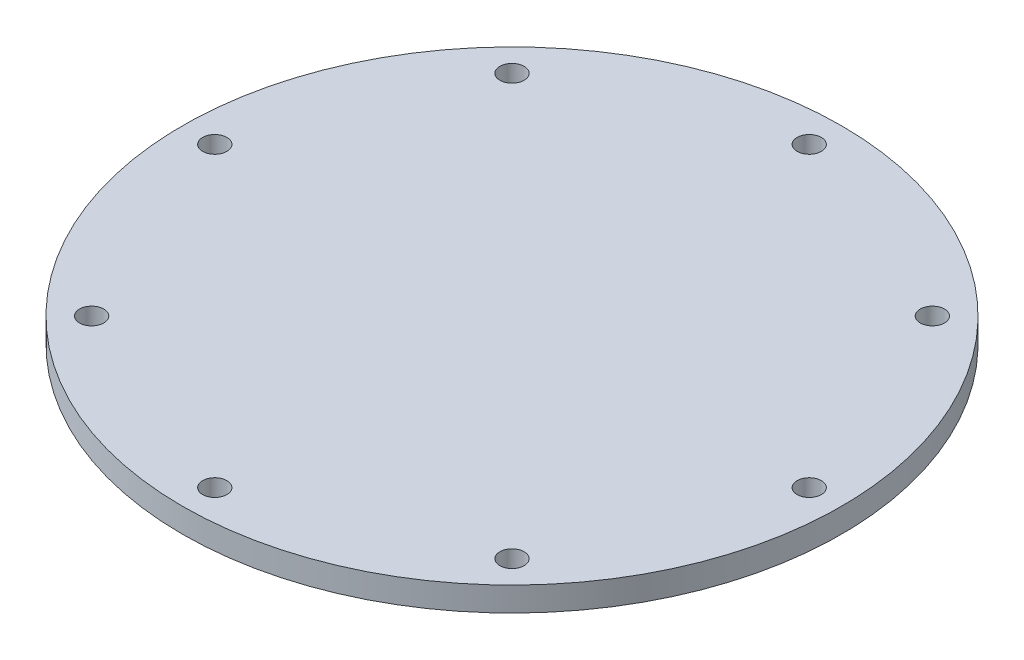
ISO-10303-21;
HEADER;
FILE_DESCRIPTION(('STEP AP214'),'2;1');
FILE_NAME('part.step','',(''),(''),'','','');
FILE_SCHEMA(('AUTOMOTIVE_DESIGN { 1 0 10303 214 1 1 1 1 }'));
ENDSEC;
DATA;
#1=APPLICATION_CONTEXT('core data for automotive mechanical design processes');
#2=APPLICATION_PROTOCOL_DEFINITION('international standard','automotive_design',2000,#1);
#3=PRODUCT_CONTEXT('',#1,'mechanical');
#4=PRODUCT('Part','Part','',(#3));
#5=PRODUCT_RELATED_PRODUCT_CATEGORY('part','',(#4));
#6=PRODUCT_DEFINITION_FORMATION('','',#4);
#7=PRODUCT_DEFINITION_CONTEXT('part definition',#1,'design');
#8=PRODUCT_DEFINITION('design','',#6,#7);
#9=PRODUCT_DEFINITION_SHAPE('','',#8);
#10=(LENGTH_UNIT() NAMED_UNIT(*) SI_UNIT(.MILLI.,.METRE.));
#11=(NAMED_UNIT(*) PLANE_ANGLE_UNIT() SI_UNIT($,.RADIAN.));
#12=(NAMED_UNIT(*) SI_UNIT($,.STERADIAN.) SOLID_ANGLE_UNIT());
#13=UNCERTAINTY_MEASURE_WITH_UNIT(LENGTH_MEASURE(1.E-05),#10,'distance_accuracy_value','');
#14=(GEOMETRIC_REPRESENTATION_CONTEXT(3) GLOBAL_UNCERTAINTY_ASSIGNED_CONTEXT((#13)) GLOBAL_UNIT_ASSIGNED_CONTEXT((#10,
#11,#12)) REPRESENTATION_CONTEXT('',''));
#15=CARTESIAN_POINT('',(0.,0.,0.));
#16=DIRECTION('',(0.,0.,1.));
#17=DIRECTION('',(1.,0.,0.));
#18=AXIS2_PLACEMENT_3D('',#15,#16,#17);
#19=CARTESIAN_POINT('',(0.,3.,0.));
#20=DIRECTION('',(0.,1.,0.));
#21=DIRECTION('',(0.,0.,1.));
#22=AXIS2_PLACEMENT_3D('',#19,#20,#21);
#23=PLANE('',#22);
#24=CARTESIAN_POINT('',(-3.15719672627779E-13,3.,36.7695526217005));
#25=DIRECTION('',(0.,1.,0.));
#26=DIRECTION('',(0.,0.,1.));
#27=AXIS2_PLACEMENT_3D('',#24,#25,#26);
#28=CIRCLE('',#27,1.5);
#29=CARTESIAN_POINT('',(-3.15719672627779E-13,3.,38.2695526217005));
#30=VERTEX_POINT('',#29);
#31=EDGE_CURVE('E102',#30,#30,#28,.T.);
#32=ORIENTED_EDGE('',*,*,#31,.F.);
#33=EDGE_LOOP('',(#32));
#34=FACE_BOUND('',#33,.T.);
#35=CARTESIAN_POINT('',(0.,3.,-36.7695526217005));
#36=DIRECTION('',(0.,1.,0.));
#37=DIRECTION('',(0.,0.,1.));
#38=AXIS2_PLACEMENT_3D('',#35,#36,#37);
#39=CIRCLE('',#38,1.5);
#40=CARTESIAN_POINT('',(0.,3.,-35.2695526217005));
#41=VERTEX_POINT('',#40);
#42=EDGE_CURVE('E86',#41,#41,#39,.T.);
#43=ORIENTED_EDGE('',*,*,#42,.F.);
#44=EDGE_LOOP('',(#43));
#45=FACE_BOUND('',#44,.T.);
#46=CARTESIAN_POINT('',(25.9999999999998,3.,26.0000000000002));
#47=DIRECTION('',(0.,1.,0.));
#48=DIRECTION('',(0.,0.,1.));
#49=AXIS2_PLACEMENT_3D('',#46,#47,#48);
#50=CIRCLE('',#49,1.5);
#51=CARTESIAN_POINT('',(25.9999999999998,3.,27.5000000000002));
#52=VERTEX_POINT('',#51);
#53=EDGE_CURVE('E70',#52,#52,#50,.T.);
#54=ORIENTED_EDGE('',*,*,#53,.F.);
#55=EDGE_LOOP('',(#54));
#56=FACE_BOUND('',#55,.T.);
#57=CARTESIAN_POINT('',(-26.,3.,-26.));
#58=DIRECTION('',(0.,1.,0.));
#59=DIRECTION('',(0.,0.,1.));
#60=AXIS2_PLACEMENT_3D('',#57,#58,#59);
#61=CIRCLE('',#60,1.5);
#62=CARTESIAN_POINT('',(-26.,3.,-24.5));
#63=VERTEX_POINT('',#62);
#64=EDGE_CURVE('E56',#63,#63,#61,.T.);
#65=ORIENTED_EDGE('',*,*,#64,.F.);
#66=EDGE_LOOP('',(#65));
#67=FACE_BOUND('',#66,.T.);
#68=CARTESIAN_POINT('',(0.,3.,0.));
#69=DIRECTION('',(0.,1.,0.));
#70=DIRECTION('',(0.,0.,1.));
#71=AXIS2_PLACEMENT_3D('',#68,#69,#70);
#72=CIRCLE('',#71,40.7695526217005);
#73=CARTESIAN_POINT('',(0.,3.,40.7695526217005));
#74=VERTEX_POINT('',#73);
#75=EDGE_CURVE('E10',#74,#74,#72,.T.);
#76=ORIENTED_EDGE('',*,*,#75,.T.);
#77=EDGE_LOOP('',(#76));
#78=FACE_BOUND('',#77,.T.);
#79=CARTESIAN_POINT('',(26.0000000000001,3.,-25.9999999999999));
#80=DIRECTION('',(0.,1.,0.));
#81=DIRECTION('',(0.,0.,1.));
#82=AXIS2_PLACEMENT_3D('',#79,#80,#81);
#83=CIRCLE('',#82,1.5);
#84=CARTESIAN_POINT('',(26.0000000000001,3.,-24.4999999999999));
#85=VERTEX_POINT('',#84);
#86=EDGE_CURVE('E62',#85,#85,#83,.T.);
#87=ORIENTED_EDGE('',*,*,#86,.F.);
#88=EDGE_LOOP('',(#87));
#89=FACE_BOUND('',#88,.T.);
#90=CARTESIAN_POINT('',(-26.0000000000003,3.,25.9999999999997));
#91=DIRECTION('',(0.,1.,0.));
#92=DIRECTION('',(0.,0.,1.));
#93=AXIS2_PLACEMENT_3D('',#90,#91,#92);
#94=CIRCLE('',#93,1.5);
#95=CARTESIAN_POINT('',(-26.0000000000003,3.,27.4999999999997));
#96=VERTEX_POINT('',#95);
#97=EDGE_CURVE('E78',#96,#96,#94,.T.);
#98=ORIENTED_EDGE('',*,*,#97,.F.);
#99=EDGE_LOOP('',(#98));
#100=FACE_BOUND('',#99,.T.);
#101=CARTESIAN_POINT('',(36.7695526217005,3.,1.90819582357449E-13));
#102=DIRECTION('',(0.,1.,0.));
#103=DIRECTION('',(0.,0.,1.));
#104=AXIS2_PLACEMENT_3D('',#101,#102,#103);
#105=CIRCLE('',#104,1.5);
#106=CARTESIAN_POINT('',(36.7695526217005,3.,1.50000000000019));
#107=VERTEX_POINT('',#106);
#108=EDGE_CURVE('E94',#107,#107,#105,.T.);
#109=ORIENTED_EDGE('',*,*,#108,.F.);
#110=EDGE_LOOP('',(#109));
#111=FACE_BOUND('',#110,.T.);
#112=CARTESIAN_POINT('',(-36.7695526217005,3.,-4.44089209850063E-13));
#113=DIRECTION('',(0.,1.,0.));
#114=DIRECTION('',(0.,0.,1.));
#115=AXIS2_PLACEMENT_3D('',#112,#113,#114);
#116=CIRCLE('',#115,1.5);
#117=CARTESIAN_POINT('',(-36.7695526217005,3.,1.49999999999956));
#118=VERTEX_POINT('',#117);
#119=EDGE_CURVE('E110',#118,#118,#116,.T.);
#120=ORIENTED_EDGE('',*,*,#119,.F.);
#121=EDGE_LOOP('',(#120));
#122=FACE_BOUND('',#121,.T.);
#123=ADVANCED_FACE('F43',(#34,#45,#56,#67,#78,#89,#100,#111,#122),#23,.T.);
#124=CARTESIAN_POINT('',(0.,0.,0.));
#125=DIRECTION('',(0.,1.,0.));
#126=DIRECTION('',(0.,0.,1.));
#127=AXIS2_PLACEMENT_3D('',#124,#125,#126);
#128=PLANE('',#127);
#129=CARTESIAN_POINT('',(0.,0.,0.));
#130=DIRECTION('',(0.,1.,0.));
#131=DIRECTION('',(0.,0.,1.));
#132=AXIS2_PLACEMENT_3D('',#129,#130,#131);
#133=CIRCLE('',#132,40.7695526217005);
#134=CARTESIAN_POINT('',(0.,0.,40.7695526217005));
#135=VERTEX_POINT('',#134);
#136=EDGE_CURVE('E47',#135,#135,#133,.T.);
#137=ORIENTED_EDGE('',*,*,#136,.F.);
#138=EDGE_LOOP('',(#137));
#139=FACE_BOUND('',#138,.T.);
#140=CARTESIAN_POINT('',(-26.,0.,-26.));
#141=DIRECTION('',(0.,1.,0.));
#142=DIRECTION('',(0.,0.,1.));
#143=AXIS2_PLACEMENT_3D('',#140,#141,#142);
#144=CIRCLE('',#143,1.5);
#145=CARTESIAN_POINT('',(-26.,0.,-24.5));
#146=VERTEX_POINT('',#145);
#147=EDGE_CURVE('E58',#146,#146,#144,.T.);
#148=ORIENTED_EDGE('',*,*,#147,.T.);
#149=EDGE_LOOP('',(#148));
#150=FACE_BOUND('',#149,.T.);
#151=CARTESIAN_POINT('',(26.0000000000001,0.,-25.9999999999999));
#152=DIRECTION('',(0.,1.,0.));
#153=DIRECTION('',(0.,0.,1.));
#154=AXIS2_PLACEMENT_3D('',#151,#152,#153);
#155=CIRCLE('',#154,1.5);
#156=CARTESIAN_POINT('',(26.0000000000001,0.,-24.4999999999999));
#157=VERTEX_POINT('',#156);
#158=EDGE_CURVE('E66',#157,#157,#155,.T.);
#159=ORIENTED_EDGE('',*,*,#158,.T.);
#160=EDGE_LOOP('',(#159));
#161=FACE_BOUND('',#160,.T.);
#162=CARTESIAN_POINT('',(25.9999999999998,0.,26.0000000000002));
#163=DIRECTION('',(0.,1.,0.));
#164=DIRECTION('',(0.,0.,1.));
#165=AXIS2_PLACEMENT_3D('',#162,#163,#164);
#166=CIRCLE('',#165,1.5);
#167=CARTESIAN_POINT('',(25.9999999999998,0.,27.5000000000002));
#168=VERTEX_POINT('',#167);
#169=EDGE_CURVE('E74',#168,#168,#166,.T.);
#170=ORIENTED_EDGE('',*,*,#169,.T.);
#171=EDGE_LOOP('',(#170));
#172=FACE_BOUND('',#171,.T.);
#173=CARTESIAN_POINT('',(-26.0000000000003,0.,25.9999999999997));
#174=DIRECTION('',(0.,1.,0.));
#175=DIRECTION('',(0.,0.,1.));
#176=AXIS2_PLACEMENT_3D('',#173,#174,#175);
#177=CIRCLE('',#176,1.5);
#178=CARTESIAN_POINT('',(-26.0000000000003,0.,27.4999999999997));
#179=VERTEX_POINT('',#178);
#180=EDGE_CURVE('E82',#179,#179,#177,.T.);
#181=ORIENTED_EDGE('',*,*,#180,.T.);
#182=EDGE_LOOP('',(#181));
#183=FACE_BOUND('',#182,.T.);
#184=CARTESIAN_POINT('',(0.,0.,-36.7695526217005));
#185=DIRECTION('',(0.,1.,0.));
#186=DIRECTION('',(0.,0.,1.));
#187=AXIS2_PLACEMENT_3D('',#184,#185,#186);
#188=CIRCLE('',#187,1.5);
#189=CARTESIAN_POINT('',(0.,0.,-35.2695526217005));
#190=VERTEX_POINT('',#189);
#191=EDGE_CURVE('E90',#190,#190,#188,.T.);
#192=ORIENTED_EDGE('',*,*,#191,.T.);
#193=EDGE_LOOP('',(#192));
#194=FACE_BOUND('',#193,.T.);
#195=CARTESIAN_POINT('',(36.7695526217005,0.,1.90819582357449E-13));
#196=DIRECTION('',(0.,1.,0.));
#197=DIRECTION('',(0.,0.,1.));
#198=AXIS2_PLACEMENT_3D('',#195,#196,#197);
#199=CIRCLE('',#198,1.5);
#200=CARTESIAN_POINT('',(36.7695526217005,0.,1.50000000000019));
#201=VERTEX_POINT('',#200);
#202=EDGE_CURVE('E98',#201,#201,#199,.T.);
#203=ORIENTED_EDGE('',*,*,#202,.T.);
#204=EDGE_LOOP('',(#203));
#205=FACE_BOUND('',#204,.T.);
#206=CARTESIAN_POINT('',(-3.15719672627779E-13,0.,36.7695526217005));
#207=DIRECTION('',(0.,1.,0.));
#208=DIRECTION('',(0.,0.,1.));
#209=AXIS2_PLACEMENT_3D('',#206,#207,#208);
#210=CIRCLE('',#209,1.5);
#211=CARTESIAN_POINT('',(-3.15719672627779E-13,0.,38.2695526217005));
#212=VERTEX_POINT('',#211);
#213=EDGE_CURVE('E106',#212,#212,#210,.T.);
#214=ORIENTED_EDGE('',*,*,#213,.T.);
#215=EDGE_LOOP('',(#214));
#216=FACE_BOUND('',#215,.T.);
#217=CARTESIAN_POINT('',(-36.7695526217005,0.,-4.44089209850063E-13));
#218=DIRECTION('',(0.,1.,0.));
#219=DIRECTION('',(0.,0.,1.));
#220=AXIS2_PLACEMENT_3D('',#217,#218,#219);
#221=CIRCLE('',#220,1.5);
#222=CARTESIAN_POINT('',(-36.7695526217005,0.,1.49999999999956));
#223=VERTEX_POINT('',#222);
#224=EDGE_CURVE('E114',#223,#223,#221,.T.);
#225=ORIENTED_EDGE('',*,*,#224,.T.);
#226=EDGE_LOOP('',(#225));
#227=FACE_BOUND('',#226,.T.);
#228=ADVANCED_FACE('F126',(#139,#150,#161,#172,#183,#194,#205,#216,#227),#128,.F.);
#229=CARTESIAN_POINT('',(0.,3.,0.));
#230=DIRECTION('',(0.,-1.,0.));
#231=DIRECTION('',(0.,0.,-1.));
#232=AXIS2_PLACEMENT_3D('',#229,#230,#231);
#233=CYLINDRICAL_SURFACE('',#232,40.7695526217005);
#234=ORIENTED_EDGE('',*,*,#75,.F.);
#235=EDGE_LOOP('',(#234));
#236=FACE_BOUND('',#235,.T.);
#237=ORIENTED_EDGE('',*,*,#136,.T.);
#238=EDGE_LOOP('',(#237));
#239=FACE_BOUND('',#238,.T.);
#240=ADVANCED_FACE('F45',(#236,#239),#233,.T.);
#241=CARTESIAN_POINT('',(-26.,3.,-26.));
#242=DIRECTION('',(0.,-1.,0.));
#243=DIRECTION('',(0.,0.,-1.));
#244=AXIS2_PLACEMENT_3D('',#241,#242,#243);
#245=CYLINDRICAL_SURFACE('',#244,1.5);
#246=ORIENTED_EDGE('',*,*,#64,.T.);
#247=EDGE_LOOP('',(#246));
#248=FACE_BOUND('',#247,.T.);
#249=ORIENTED_EDGE('',*,*,#147,.F.);
#250=EDGE_LOOP('',(#249));
#251=FACE_BOUND('',#250,.T.);
#252=ADVANCED_FACE('F136',(#248,#251),#245,.F.);
#253=CARTESIAN_POINT('',(26.0000000000001,3.,-25.9999999999999));
#254=DIRECTION('',(0.,-1.,0.));
#255=DIRECTION('',(0.,0.,-1.));
#256=AXIS2_PLACEMENT_3D('',#253,#254,#255);
#257=CYLINDRICAL_SURFACE('',#256,1.5);
#258=ORIENTED_EDGE('',*,*,#86,.T.);
#259=EDGE_LOOP('',(#258));
#260=FACE_BOUND('',#259,.T.);
#261=ORIENTED_EDGE('',*,*,#158,.F.);
#262=EDGE_LOOP('',(#261));
#263=FACE_BOUND('',#262,.T.);
#264=ADVANCED_FACE('F139',(#260,#263),#257,.F.);
#265=CARTESIAN_POINT('',(25.9999999999998,3.,26.0000000000002));
#266=DIRECTION('',(0.,-1.,0.));
#267=DIRECTION('',(0.,0.,-1.));
#268=AXIS2_PLACEMENT_3D('',#265,#266,#267);
#269=CYLINDRICAL_SURFACE('',#268,1.5);
#270=ORIENTED_EDGE('',*,*,#53,.T.);
#271=EDGE_LOOP('',(#270));
#272=FACE_BOUND('',#271,.T.);
#273=ORIENTED_EDGE('',*,*,#169,.F.);
#274=EDGE_LOOP('',(#273));
#275=FACE_BOUND('',#274,.T.);
#276=ADVANCED_FACE('F143',(#272,#275),#269,.F.);
#277=CARTESIAN_POINT('',(-26.0000000000003,3.,25.9999999999997));
#278=DIRECTION('',(0.,-1.,0.));
#279=DIRECTION('',(0.,0.,-1.));
#280=AXIS2_PLACEMENT_3D('',#277,#278,#279);
#281=CYLINDRICAL_SURFACE('',#280,1.5);
#282=ORIENTED_EDGE('',*,*,#97,.T.);
#283=EDGE_LOOP('',(#282));
#284=FACE_BOUND('',#283,.T.);
#285=ORIENTED_EDGE('',*,*,#180,.F.);
#286=EDGE_LOOP('',(#285));
#287=FACE_BOUND('',#286,.T.);
#288=ADVANCED_FACE('F147',(#284,#287),#281,.F.);
#289=CARTESIAN_POINT('',(0.,3.,-36.7695526217005));
#290=DIRECTION('',(0.,-1.,0.));
#291=DIRECTION('',(0.,0.,-1.));
#292=AXIS2_PLACEMENT_3D('',#289,#290,#291);
#293=CYLINDRICAL_SURFACE('',#292,1.5);
#294=ORIENTED_EDGE('',*,*,#42,.T.);
#295=EDGE_LOOP('',(#294));
#296=FACE_BOUND('',#295,.T.);
#297=ORIENTED_EDGE('',*,*,#191,.F.);
#298=EDGE_LOOP('',(#297));
#299=FACE_BOUND('',#298,.T.);
#300=ADVANCED_FACE('F151',(#296,#299),#293,.F.);
#301=CARTESIAN_POINT('',(36.7695526217005,3.,1.90819582357449E-13));
#302=DIRECTION('',(0.,-1.,0.));
#303=DIRECTION('',(0.,0.,-1.));
#304=AXIS2_PLACEMENT_3D('',#301,#302,#303);
#305=CYLINDRICAL_SURFACE('',#304,1.5);
#306=ORIENTED_EDGE('',*,*,#108,.T.);
#307=EDGE_LOOP('',(#306));
#308=FACE_BOUND('',#307,.T.);
#309=ORIENTED_EDGE('',*,*,#202,.F.);
#310=EDGE_LOOP('',(#309));
#311=FACE_BOUND('',#310,.T.);
#312=ADVANCED_FACE('F155',(#308,#311),#305,.F.);
#313=CARTESIAN_POINT('',(-3.15719672627779E-13,3.,36.7695526217005));
#314=DIRECTION('',(0.,-1.,0.));
#315=DIRECTION('',(0.,0.,-1.));
#316=AXIS2_PLACEMENT_3D('',#313,#314,#315);
#317=CYLINDRICAL_SURFACE('',#316,1.5);
#318=ORIENTED_EDGE('',*,*,#31,.T.);
#319=EDGE_LOOP('',(#318));
#320=FACE_BOUND('',#319,.T.);
#321=ORIENTED_EDGE('',*,*,#213,.F.);
#322=EDGE_LOOP('',(#321));
#323=FACE_BOUND('',#322,.T.);
#324=ADVANCED_FACE('F159',(#320,#323),#317,.F.);
#325=CARTESIAN_POINT('',(-36.7695526217005,3.,-4.44089209850063E-13));
#326=DIRECTION('',(0.,-1.,0.));
#327=DIRECTION('',(0.,0.,-1.));
#328=AXIS2_PLACEMENT_3D('',#325,#326,#327);
#329=CYLINDRICAL_SURFACE('',#328,1.5);
#330=ORIENTED_EDGE('',*,*,#119,.T.);
#331=EDGE_LOOP('',(#330));
#332=FACE_BOUND('',#331,.T.);
#333=ORIENTED_EDGE('',*,*,#224,.F.);
#334=EDGE_LOOP('',(#333));
#335=FACE_BOUND('',#334,.T.);
#336=ADVANCED_FACE('F122',(#332,#335),#329,.F.);
#337=CLOSED_SHELL('',(#123,#228,#240,#252,#264,#276,#288,#300,#312,#324,#336));
#338=MANIFOLD_SOLID_BREP('B2',#337);
#339=ADVANCED_BREP_SHAPE_REPRESENTATION('',(#18,#338),#14);
#340=SHAPE_DEFINITION_REPRESENTATION(#9,#339);
ENDSEC;
END-ISO-10303-21;
